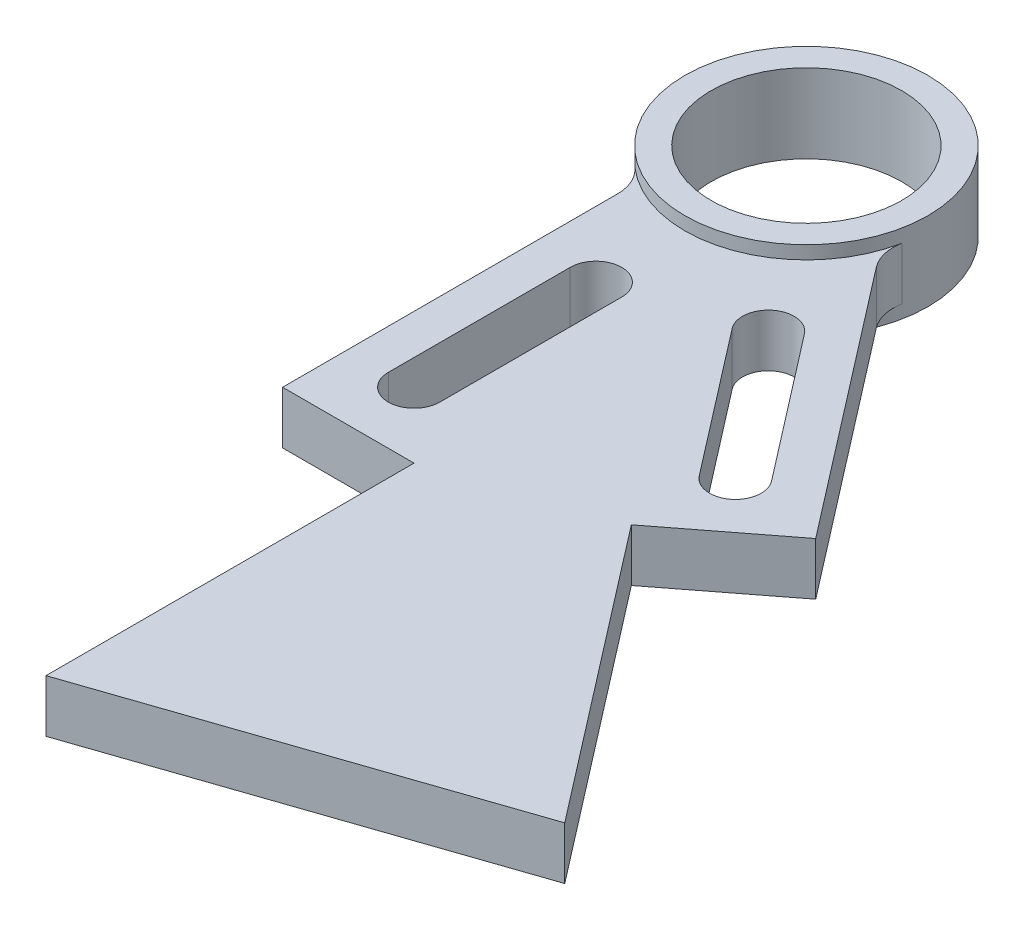
ISO-10303-21;
HEADER;
FILE_DESCRIPTION(('STEP AP214'),'2;1');
FILE_NAME('part.step','',(''),(''),'','','');
FILE_SCHEMA(('AUTOMOTIVE_DESIGN { 1 0 10303 214 1 1 1 1 }'));
ENDSEC;
DATA;
#1=APPLICATION_CONTEXT('core data for automotive mechanical design processes');
#2=APPLICATION_PROTOCOL_DEFINITION('international standard','automotive_design',2000,#1);
#3=PRODUCT_CONTEXT('',#1,'mechanical');
#4=PRODUCT('Part','Part','',(#3));
#5=PRODUCT_RELATED_PRODUCT_CATEGORY('part','',(#4));
#6=PRODUCT_DEFINITION_FORMATION('','',#4);
#7=PRODUCT_DEFINITION_CONTEXT('part definition',#1,'design');
#8=PRODUCT_DEFINITION('design','',#6,#7);
#9=PRODUCT_DEFINITION_SHAPE('','',#8);
#10=(LENGTH_UNIT() NAMED_UNIT(*) SI_UNIT(.MILLI.,.METRE.));
#11=(NAMED_UNIT(*) PLANE_ANGLE_UNIT() SI_UNIT($,.RADIAN.));
#12=(NAMED_UNIT(*) SI_UNIT($,.STERADIAN.) SOLID_ANGLE_UNIT());
#13=UNCERTAINTY_MEASURE_WITH_UNIT(LENGTH_MEASURE(1.E-05),#10,'distance_accuracy_value','');
#14=(GEOMETRIC_REPRESENTATION_CONTEXT(3) GLOBAL_UNCERTAINTY_ASSIGNED_CONTEXT((#13)) GLOBAL_UNIT_ASSIGNED_CONTEXT((#10,
#11,#12)) REPRESENTATION_CONTEXT('',''));
#15=CARTESIAN_POINT('',(0.,0.,0.));
#16=DIRECTION('',(0.,0.,1.));
#17=DIRECTION('',(1.,0.,0.));
#18=AXIS2_PLACEMENT_3D('',#15,#16,#17);
#19=CARTESIAN_POINT('',(0.,4.7625,0.));
#20=DIRECTION('',(0.,-1.,0.));
#21=DIRECTION('',(0.,0.,-1.));
#22=AXIS2_PLACEMENT_3D('',#19,#20,#21);
#23=CYLINDRICAL_SURFACE('',#22,11.5062);
#24=CARTESIAN_POINT('',(0.,4.7625,0.));
#25=DIRECTION('',(0.,1.,0.));
#26=DIRECTION('',(0.,0.,1.));
#27=AXIS2_PLACEMENT_3D('',#24,#25,#26);
#28=CIRCLE('',#27,11.5062);
#29=CARTESIAN_POINT('',(0.,4.7625,-11.5062));
#30=VERTEX_POINT('',#29);
#31=EDGE_CURVE('E353',#30,#30,#28,.T.);
#32=CARTESIAN_POINT('',(0.,-4.7625,0.));
#33=DIRECTION('',(0.,1.,0.));
#34=DIRECTION('',(0.,0.,1.));
#35=AXIS2_PLACEMENT_3D('',#32,#33,#34);
#36=CIRCLE('',#35,11.5062);
#37=CARTESIAN_POINT('',(0.,-4.7625,-11.5062));
#38=VERTEX_POINT('',#37);
#39=EDGE_CURVE('E326',#38,#38,#36,.T.);
#40=CARTESIAN_POINT('',(0.,4.7625,-11.5062));
#41=CARTESIAN_POINT('',(0.,4.66328125,-11.5062));
#42=CARTESIAN_POINT('',(0.,4.5640625,-11.5062));
#43=CARTESIAN_POINT('',(0.,4.365625,-11.5062));
#44=CARTESIAN_POINT('',(0.,4.26640625,-11.5062));
#45=CARTESIAN_POINT('',(0.,4.06796875,-11.5062));
#46=CARTESIAN_POINT('',(0.,3.96875,-11.5062));
#47=CARTESIAN_POINT('',(0.,3.7703125,-11.5062));
#48=CARTESIAN_POINT('',(0.,3.67109375,-11.5062));
#49=CARTESIAN_POINT('',(0.,3.47265625,-11.5062));
#50=CARTESIAN_POINT('',(0.,3.3734375,-11.5062));
#51=CARTESIAN_POINT('',(0.,3.175,-11.5062));
#52=CARTESIAN_POINT('',(0.,3.07578125,-11.5062));
#53=CARTESIAN_POINT('',(0.,2.87734375,-11.5062));
#54=CARTESIAN_POINT('',(0.,2.778125,-11.5062));
#55=CARTESIAN_POINT('',(0.,2.5796875,-11.5062));
#56=CARTESIAN_POINT('',(0.,2.48046875,-11.5062));
#57=CARTESIAN_POINT('',(0.,2.28203125,-11.5062));
#58=CARTESIAN_POINT('',(0.,2.1828125,-11.5062));
#59=CARTESIAN_POINT('',(0.,1.984375,-11.5062));
#60=CARTESIAN_POINT('',(0.,1.88515625,-11.5062));
#61=CARTESIAN_POINT('',(0.,1.68671875,-11.5062));
#62=CARTESIAN_POINT('',(0.,1.5875,-11.5062));
#63=CARTESIAN_POINT('',(0.,1.3890625,-11.5062));
#64=CARTESIAN_POINT('',(0.,1.28984375,-11.5062));
#65=CARTESIAN_POINT('',(0.,1.09140625,-11.5062));
#66=CARTESIAN_POINT('',(0.,0.992187499999999,-11.5062));
#67=CARTESIAN_POINT('',(0.,0.79375,-11.5062));
#68=CARTESIAN_POINT('',(0.,0.69453125,-11.5062));
#69=CARTESIAN_POINT('',(0.,0.49609375,-11.5062));
#70=CARTESIAN_POINT('',(0.,0.396875,-11.5062));
#71=CARTESIAN_POINT('',(0.,0.1984375,-11.5062));
#72=CARTESIAN_POINT('',(0.,0.0992187500000001,-11.5062));
#73=CARTESIAN_POINT('',(0.,-0.0992187500000001,-11.5062));
#74=CARTESIAN_POINT('',(0.,-0.1984375,-11.5062));
#75=CARTESIAN_POINT('',(0.,-0.396875,-11.5062));
#76=CARTESIAN_POINT('',(0.,-0.49609375,-11.5062));
#77=CARTESIAN_POINT('',(0.,-0.69453125,-11.5062));
#78=CARTESIAN_POINT('',(0.,-0.793750000000001,-11.5062));
#79=CARTESIAN_POINT('',(0.,-0.992187500000001,-11.5062));
#80=CARTESIAN_POINT('',(0.,-1.09140625,-11.5062));
#81=CARTESIAN_POINT('',(0.,-1.28984375,-11.5062));
#82=CARTESIAN_POINT('',(0.,-1.3890625,-11.5062));
#83=CARTESIAN_POINT('',(0.,-1.5875,-11.5062));
#84=CARTESIAN_POINT('',(0.,-1.68671875,-11.5062));
#85=CARTESIAN_POINT('',(0.,-1.88515625,-11.5062));
#86=CARTESIAN_POINT('',(0.,-1.984375,-11.5062));
#87=CARTESIAN_POINT('',(0.,-2.1828125,-11.5062));
#88=CARTESIAN_POINT('',(0.,-2.28203125,-11.5062));
#89=CARTESIAN_POINT('',(0.,-2.48046875,-11.5062));
#90=CARTESIAN_POINT('',(0.,-2.5796875,-11.5062));
#91=CARTESIAN_POINT('',(0.,-2.778125,-11.5062));
#92=CARTESIAN_POINT('',(0.,-2.87734375,-11.5062));
#93=CARTESIAN_POINT('',(0.,-3.07578125,-11.5062));
#94=CARTESIAN_POINT('',(0.,-3.175,-11.5062));
#95=CARTESIAN_POINT('',(0.,-3.3734375,-11.5062));
#96=CARTESIAN_POINT('',(0.,-3.47265625,-11.5062));
#97=CARTESIAN_POINT('',(0.,-3.67109375,-11.5062));
#98=CARTESIAN_POINT('',(0.,-3.7703125,-11.5062));
#99=CARTESIAN_POINT('',(0.,-3.96875,-11.5062));
#100=CARTESIAN_POINT('',(0.,-4.06796875,-11.5062));
#101=CARTESIAN_POINT('',(0.,-4.26640625,-11.5062));
#102=CARTESIAN_POINT('',(0.,-4.365625,-11.5062));
#103=CARTESIAN_POINT('',(0.,-4.5640625,-11.5062));
#104=CARTESIAN_POINT('',(0.,-4.66328125,-11.5062));
#105=CARTESIAN_POINT('',(0.,-4.7625,-11.5062));
#106=B_SPLINE_CURVE_WITH_KNOTS('',3,(#40,#41,#42,#43,#44,#45,#46,#47,#48,#49,#50,#51,#52,#53,
#54,#55,#56,#57,#58,#59,#60,#61,#62,#63,#64,#65,#66,#67,#68,#69,#70,#71,#72,#73,#74,#75,#76,#77,
#78,#79,#80,#81,#82,#83,#84,#85,#86,#87,#88,#89,#90,#91,#92,#93,#94,#95,#96,#97,#98,#99,#100,
#101,#102,#103,#104,#105),.UNSPECIFIED.,.F.,.F.,(4,2,2,2,2,2,2,2,2,2,2,2,2,2,2,2,2,2,2,2,2,2,2,
2,2,2,2,2,2,2,2,2,4),(0.,0.29765625,0.5953125,0.892968750000001,1.190625,1.48828125,1.7859375,
2.08359375,2.38125,2.67890625,2.9765625,3.27421875,3.571875,3.86953125,4.1671875,4.46484375,
4.7625,5.06015625,5.3578125,5.65546875,5.953125,6.25078125,6.5484375,6.84609375,7.14375,
7.44140625,7.7390625,8.03671875,8.334375,8.63203125,8.9296875,9.22734375,9.525),.UNSPECIFIED.);
#107=EDGE_CURVE('BSEAM48',#30,#38,#106,.T.);
#108=ORIENTED_EDGE('',*,*,#31,.T.);
#109=ORIENTED_EDGE('',*,*,#39,.F.);
#110=ORIENTED_EDGE('',*,*,#107,.T.);
#111=ORIENTED_EDGE('',*,*,#107,.F.);
#112=EDGE_LOOP('',(#108,#110,#109,#111));
#113=FACE_BOUND('',#112,.T.);
#114=ADVANCED_FACE('F48',(#113),#23,.F.);
#115=CARTESIAN_POINT('',(0.,4.7625,0.));
#116=DIRECTION('',(0.,-1.,0.));
#117=DIRECTION('',(0.,0.,-1.));
#118=AXIS2_PLACEMENT_3D('',#115,#116,#117);
#119=CYLINDRICAL_SURFACE('',#118,14.6812);
#120=DIRECTION('',(0.,-1.,0.));
#121=VECTOR('',#120,1.);
#122=CARTESIAN_POINT('',(14.4042451276911,4.7625,2.83819586029353));
#123=LINE('',#122,#121);
#124=CARTESIAN_POINT('',(14.4042451276911,3.175,2.83819586029353));
#125=VERTEX_POINT('',#124);
#126=CARTESIAN_POINT('',(14.4042451276911,-3.175,2.83819586029353));
#127=VERTEX_POINT('',#126);
#128=EDGE_CURVE('E372',#125,#127,#123,.T.);
#129=ORIENTED_EDGE('',*,*,#128,.T.);
#130=CARTESIAN_POINT('',(0.,-3.175,0.));
#131=DIRECTION('',(0.,1.,0.));
#132=DIRECTION('',(0.,0.,1.));
#133=AXIS2_PLACEMENT_3D('',#130,#131,#132);
#134=CIRCLE('',#133,14.6812);
#135=CARTESIAN_POINT('',(-9.67109897172235,-3.175,11.0456995305481));
#136=VERTEX_POINT('',#135);
#137=EDGE_CURVE('E279',#136,#127,#134,.T.);
#138=ORIENTED_EDGE('',*,*,#137,.F.);
#139=DIRECTION('',(0.,-1.,0.));
#140=VECTOR('',#139,1.);
#141=CARTESIAN_POINT('',(-9.67109897172235,4.7625,11.0456995305481));
#142=LINE('',#141,#140);
#143=CARTESIAN_POINT('',(-9.67109897172235,3.175,11.0456995305481));
#144=VERTEX_POINT('',#143);
#145=EDGE_CURVE('E362',#136,#144,#142,.F.);
#146=ORIENTED_EDGE('',*,*,#145,.T.);
#147=CARTESIAN_POINT('',(0.,3.175,0.));
#148=DIRECTION('',(0.,1.,0.));
#149=DIRECTION('',(0.,0.,1.));
#150=AXIS2_PLACEMENT_3D('',#147,#148,#149);
#151=CIRCLE('',#150,14.6812);
#152=EDGE_CURVE('E221',#144,#125,#151,.T.);
#153=ORIENTED_EDGE('',*,*,#152,.T.);
#154=EDGE_LOOP('',(#129,#138,#146,#153));
#155=FACE_BOUND('',#154,.T.);
#156=CARTESIAN_POINT('',(0.,4.7625,0.));
#157=DIRECTION('',(0.,1.,0.));
#158=DIRECTION('',(0.,0.,1.));
#159=AXIS2_PLACEMENT_3D('',#156,#157,#158);
#160=CIRCLE('',#159,14.6812);
#161=CARTESIAN_POINT('',(0.,4.7625,14.6812));
#162=VERTEX_POINT('',#161);
#163=EDGE_CURVE('E357',#162,#162,#160,.T.);
#164=ORIENTED_EDGE('',*,*,#163,.F.);
#165=EDGE_LOOP('',(#164));
#166=FACE_BOUND('',#165,.T.);
#167=CARTESIAN_POINT('',(0.,-4.7625,0.));
#168=DIRECTION('',(0.,1.,0.));
#169=DIRECTION('',(0.,0.,1.));
#170=AXIS2_PLACEMENT_3D('',#167,#168,#169);
#171=CIRCLE('',#170,14.6812);
#172=CARTESIAN_POINT('',(0.,-4.7625,14.6812));
#173=VERTEX_POINT('',#172);
#174=EDGE_CURVE('E358',#173,#173,#171,.T.);
#175=ORIENTED_EDGE('',*,*,#174,.T.);
#176=EDGE_LOOP('',(#175));
#177=FACE_BOUND('',#176,.T.);
#178=ADVANCED_FACE('F396',(#155,#166,#177),#119,.T.);
#179=CARTESIAN_POINT('',(0.,4.7625,0.));
#180=DIRECTION('',(0.,1.,0.));
#181=DIRECTION('',(0.,0.,1.));
#182=AXIS2_PLACEMENT_3D('',#179,#180,#181);
#183=PLANE('',#182);
#184=ORIENTED_EDGE('',*,*,#31,.F.);
#185=EDGE_LOOP('',(#184));
#186=FACE_BOUND('',#185,.T.);
#187=ORIENTED_EDGE('',*,*,#163,.T.);
#188=EDGE_LOOP('',(#187));
#189=FACE_BOUND('',#188,.T.);
#190=ADVANCED_FACE('F460',(#186,#189),#183,.T.);
#191=CARTESIAN_POINT('',(0.,-4.7625,0.));
#192=DIRECTION('',(0.,1.,0.));
#193=DIRECTION('',(0.,0.,1.));
#194=AXIS2_PLACEMENT_3D('',#191,#192,#193);
#195=PLANE('',#194);
#196=ORIENTED_EDGE('',*,*,#39,.T.);
#197=EDGE_LOOP('',(#196));
#198=FACE_BOUND('',#197,.T.);
#199=ORIENTED_EDGE('',*,*,#174,.F.);
#200=EDGE_LOOP('',(#199));
#201=FACE_BOUND('',#200,.T.);
#202=ADVANCED_FACE('F464',(#198,#201),#195,.F.);
#203=CARTESIAN_POINT('',(0.,3.175,25.4127));
#204=DIRECTION('',(0.,-1.,0.));
#205=DIRECTION('',(0.,0.,-1.));
#206=AXIS2_PLACEMENT_3D('',#203,#204,#205);
#207=CYLINDRICAL_SURFACE('',#206,3.1115);
#208=CARTESIAN_POINT('',(0.,-3.175,25.4127));
#209=DIRECTION('',(0.,1.,0.));
#210=DIRECTION('',(0.,0.,1.));
#211=AXIS2_PLACEMENT_3D('',#208,#209,#210);
#212=CIRCLE('',#211,3.1115);
#213=CARTESIAN_POINT('',(3.1115,-3.175,25.4127));
#214=VERTEX_POINT('',#213);
#215=CARTESIAN_POINT('',(-3.11150000000001,-3.175,25.4127));
#216=VERTEX_POINT('',#215);
#217=EDGE_CURVE('E298',#214,#216,#212,.T.);
#218=ORIENTED_EDGE('',*,*,#217,.F.);
#219=DIRECTION('',(0.,-1.,0.));
#220=VECTOR('',#219,1.);
#221=CARTESIAN_POINT('',(3.1115,3.175,25.4127));
#222=LINE('',#221,#220);
#223=CARTESIAN_POINT('',(3.1115,3.175,25.4127));
#224=VERTEX_POINT('',#223);
#225=EDGE_CURVE('E323',#224,#214,#222,.T.);
#226=ORIENTED_EDGE('',*,*,#225,.F.);
#227=CARTESIAN_POINT('',(0.,3.175,25.4127));
#228=DIRECTION('',(0.,1.,0.));
#229=DIRECTION('',(0.,0.,1.));
#230=AXIS2_PLACEMENT_3D('',#227,#228,#229);
#231=CIRCLE('',#230,3.1115);
#232=CARTESIAN_POINT('',(-3.11150000000001,3.175,25.4127));
#233=VERTEX_POINT('',#232);
#234=EDGE_CURVE('E238',#224,#233,#231,.T.);
#235=ORIENTED_EDGE('',*,*,#234,.T.);
#236=DIRECTION('',(0.,-1.,0.));
#237=VECTOR('',#236,1.);
#238=CARTESIAN_POINT('',(-3.11150000000001,3.175,25.4127));
#239=LINE('',#238,#237);
#240=EDGE_CURVE('E313',#233,#216,#239,.T.);
#241=ORIENTED_EDGE('',*,*,#240,.T.);
#242=EDGE_LOOP('',(#218,#226,#235,#241));
#243=FACE_BOUND('',#242,.T.);
#244=ADVANCED_FACE('F445',(#243),#207,.F.);
#245=CARTESIAN_POINT('',(3.11149999999999,3.175,0.));
#246=DIRECTION('',(-1.,0.,0.));
#247=DIRECTION('',(0.,0.,1.));
#248=AXIS2_PLACEMENT_3D('',#245,#246,#247);
#249=PLANE('',#248);
#250=DIRECTION('',(0.,0.,-1.));
#251=VECTOR('',#250,1.);
#252=CARTESIAN_POINT('',(3.11149999999999,-3.175,0.));
#253=LINE('',#252,#251);
#254=CARTESIAN_POINT('',(3.1115,-3.175,47.3837));
#255=VERTEX_POINT('',#254);
#256=EDGE_CURVE('E302',#255,#214,#253,.T.);
#257=ORIENTED_EDGE('',*,*,#256,.F.);
#258=DIRECTION('',(0.,-1.,0.));
#259=VECTOR('',#258,1.);
#260=CARTESIAN_POINT('',(3.1115,3.175,47.3837));
#261=LINE('',#260,#259);
#262=CARTESIAN_POINT('',(3.1115,3.175,47.3837));
#263=VERTEX_POINT('',#262);
#264=EDGE_CURVE('E320',#263,#255,#261,.T.);
#265=ORIENTED_EDGE('',*,*,#264,.F.);
#266=DIRECTION('',(0.,0.,-1.));
#267=VECTOR('',#266,1.);
#268=CARTESIAN_POINT('',(3.11149999999999,3.175,0.));
#269=LINE('',#268,#267);
#270=EDGE_CURVE('E242',#263,#224,#269,.T.);
#271=ORIENTED_EDGE('',*,*,#270,.T.);
#272=ORIENTED_EDGE('',*,*,#225,.T.);
#273=EDGE_LOOP('',(#257,#265,#271,#272));
#274=FACE_BOUND('',#273,.T.);
#275=ADVANCED_FACE('F438',(#274),#249,.T.);
#276=CARTESIAN_POINT('',(0.,3.175,47.3837));
#277=DIRECTION('',(0.,-1.,0.));
#278=DIRECTION('',(0.,0.,-1.));
#279=AXIS2_PLACEMENT_3D('',#276,#277,#278);
#280=CYLINDRICAL_SURFACE('',#279,3.1115);
#281=CARTESIAN_POINT('',(0.,-3.175,47.3837));
#282=DIRECTION('',(0.,1.,0.));
#283=DIRECTION('',(0.,0.,1.));
#284=AXIS2_PLACEMENT_3D('',#281,#282,#283);
#285=CIRCLE('',#284,3.1115);
#286=CARTESIAN_POINT('',(-3.1115,-3.175,47.3837));
#287=VERTEX_POINT('',#286);
#288=EDGE_CURVE('E306',#287,#255,#285,.T.);
#289=ORIENTED_EDGE('',*,*,#288,.F.);
#290=DIRECTION('',(0.,-1.,0.));
#291=VECTOR('',#290,1.);
#292=CARTESIAN_POINT('',(-3.1115,3.175,47.3837));
#293=LINE('',#292,#291);
#294=CARTESIAN_POINT('',(-3.1115,3.175,47.3837));
#295=VERTEX_POINT('',#294);
#296=EDGE_CURVE('E316',#295,#287,#293,.T.);
#297=ORIENTED_EDGE('',*,*,#296,.F.);
#298=CARTESIAN_POINT('',(0.,3.175,47.3837));
#299=DIRECTION('',(0.,1.,0.));
#300=DIRECTION('',(0.,0.,1.));
#301=AXIS2_PLACEMENT_3D('',#298,#299,#300);
#302=CIRCLE('',#301,3.1115);
#303=EDGE_CURVE('E246',#295,#263,#302,.T.);
#304=ORIENTED_EDGE('',*,*,#303,.T.);
#305=ORIENTED_EDGE('',*,*,#264,.T.);
#306=EDGE_LOOP('',(#289,#297,#304,#305));
#307=FACE_BOUND('',#306,.T.);
#308=ADVANCED_FACE('F442',(#307),#280,.F.);
#309=CARTESIAN_POINT('',(-6.28461938917185,3.175,4.84844979176339));
#310=DIRECTION('',(0.791763072651539,0.,-0.610828320222134));
#311=DIRECTION('',(-0.610828320222134,0.,-0.791763072651539));
#312=AXIS2_PLACEMENT_3D('',#309,#310,#311);
#313=PLANE('',#312);
#314=DIRECTION('',(0.610828320222134,0.,0.791763072651539));
#315=VECTOR('',#314,1.);
#316=CARTESIAN_POINT('',(-6.28461938917185,-3.175,4.84844979176339));
#317=LINE('',#316,#315);
#318=CARTESIAN_POINT('',(27.5071362795009,-3.175,48.6497330865337));
#319=VERTEX_POINT('',#318);
#320=CARTESIAN_POINT('',(54.6584551133747,-3.175,83.8436016658946));
#321=VERTEX_POINT('',#320);
#322=EDGE_CURVE('E267',#319,#321,#317,.T.);
#323=ORIENTED_EDGE('',*,*,#322,.F.);
#324=DIRECTION('',(0.,-1.,0.));
#325=VECTOR('',#324,1.);
#326=CARTESIAN_POINT('',(27.5071362795009,3.175,48.6497330865337));
#327=LINE('',#326,#325);
#328=CARTESIAN_POINT('',(27.5071362795009,3.175,48.6497330865337));
#329=VERTEX_POINT('',#328);
#330=EDGE_CURVE('E317',#329,#319,#327,.T.);
#331=ORIENTED_EDGE('',*,*,#330,.F.);
#332=DIRECTION('',(0.610828320222134,0.,0.791763072651539));
#333=VECTOR('',#332,1.);
#334=CARTESIAN_POINT('',(-6.28461938917185,3.175,4.84844979176339));
#335=LINE('',#334,#333);
#336=CARTESIAN_POINT('',(54.6584551133747,3.175,83.8436016658946));
#337=VERTEX_POINT('',#336);
#338=EDGE_CURVE('E209',#329,#337,#335,.T.);
#339=ORIENTED_EDGE('',*,*,#338,.T.);
#340=DIRECTION('',(0.,-1.,0.));
#341=VECTOR('',#340,1.);
#342=CARTESIAN_POINT('',(54.6584551133747,3.175,83.8436016658946));
#343=LINE('',#342,#341);
#344=EDGE_CURVE('E185',#337,#321,#343,.T.);
#345=ORIENTED_EDGE('',*,*,#344,.T.);
#346=EDGE_LOOP('',(#323,#331,#339,#345));
#347=FACE_BOUND('',#346,.T.);
#348=ADVANCED_FACE('F412',(#347),#313,.T.);
#349=CARTESIAN_POINT('',(33.7917556686727,3.175,43.8012832947703));
#350=DIRECTION('',(-0.610828320222133,0.,-0.791763072651539));
#351=DIRECTION('',(-0.791763072651539,0.,0.610828320222133));
#352=AXIS2_PLACEMENT_3D('',#349,#350,#351);
#353=PLANE('',#352);
#354=DIRECTION('',(0.791763072651539,0.,-0.610828320222133));
#355=VECTOR('',#354,1.);
#356=CARTESIAN_POINT('',(33.7917556686727,-3.175,43.8012832947703));
#357=LINE('',#356,#355);
#358=CARTESIAN_POINT('',(40.076375057844,-3.175,38.9528335030073));
#359=VERTEX_POINT('',#358);
#360=EDGE_CURVE('E271',#319,#359,#357,.T.);
#361=ORIENTED_EDGE('',*,*,#360,.T.);
#362=DIRECTION('',(0.,-1.,0.));
#363=VECTOR('',#362,1.);
#364=CARTESIAN_POINT('',(40.076375057844,3.175,38.9528335030073));
#365=LINE('',#364,#363);
#366=CARTESIAN_POINT('',(40.076375057844,3.175,38.9528335030073));
#367=VERTEX_POINT('',#366);
#368=EDGE_CURVE('E340',#367,#359,#365,.T.);
#369=ORIENTED_EDGE('',*,*,#368,.F.);
#370=DIRECTION('',(0.791763072651539,0.,-0.610828320222133));
#371=VECTOR('',#370,1.);
#372=CARTESIAN_POINT('',(33.7917556686727,3.175,43.8012832947703));
#373=LINE('',#372,#371);
#374=EDGE_CURVE('E213',#329,#367,#373,.T.);
#375=ORIENTED_EDGE('',*,*,#374,.F.);
#376=ORIENTED_EDGE('',*,*,#330,.T.);
#377=EDGE_LOOP('',(#361,#369,#375,#376));
#378=FACE_BOUND('',#377,.T.);
#379=ADVANCED_FACE('F409',(#378),#353,.F.);
#380=CARTESIAN_POINT('',(6.28461938917137,3.175,-4.84844979176301));
#381=DIRECTION('',(-0.79176307265154,0.,0.610828320222133));
#382=DIRECTION('',(0.610828320222133,0.,0.79176307265154));
#383=AXIS2_PLACEMENT_3D('',#380,#381,#382);
#384=PLANE('',#383);
#385=DIRECTION('',(-0.610828320222133,0.,-0.79176307265154));
#386=VECTOR('',#385,1.);
#387=CARTESIAN_POINT('',(6.28461938917137,-3.175,-4.84844979176301));
#388=LINE('',#387,#386);
#389=CARTESIAN_POINT('',(15.3662565828742,-3.175,6.92327841916506));
#390=VERTEX_POINT('',#389);
#391=EDGE_CURVE('E275',#359,#390,#388,.T.);
#392=ORIENTED_EDGE('',*,*,#391,.T.);
#393=DIRECTION('',(0.,1.,0.));
#394=VECTOR('',#393,1.);
#395=CARTESIAN_POINT('',(15.3662565828742,3.175,6.92327841916506));
#396=LINE('',#395,#394);
#397=CARTESIAN_POINT('',(15.3662565828742,3.175,6.92327841916506));
#398=VERTEX_POINT('',#397);
#399=EDGE_CURVE('E376',#390,#398,#396,.T.);
#400=ORIENTED_EDGE('',*,*,#399,.T.);
#401=DIRECTION('',(-0.610828320222133,0.,-0.79176307265154));
#402=VECTOR('',#401,1.);
#403=CARTESIAN_POINT('',(6.28461938917137,3.175,-4.84844979176301));
#404=LINE('',#403,#402);
#405=EDGE_CURVE('E217',#367,#398,#404,.T.);
#406=ORIENTED_EDGE('',*,*,#405,.F.);
#407=ORIENTED_EDGE('',*,*,#368,.T.);
#408=EDGE_LOOP('',(#392,#400,#406,#407));
#409=FACE_BOUND('',#408,.T.);
#410=ADVANCED_FACE('F405',(#409),#384,.F.);
#411=CARTESIAN_POINT('',(-7.93749999999998,3.175,0.));
#412=DIRECTION('',(-1.,0.,0.));
#413=DIRECTION('',(0.,0.,1.));
#414=AXIS2_PLACEMENT_3D('',#411,#412,#413);
#415=PLANE('',#414);
#416=DIRECTION('',(0.,0.,-1.));
#417=VECTOR('',#416,1.);
#418=CARTESIAN_POINT('',(-7.93749999999998,3.175,0.));
#419=LINE('',#418,#417);
#420=CARTESIAN_POINT('',(-7.93749999999998,3.175,55.3212));
#421=VERTEX_POINT('',#420);
#422=CARTESIAN_POINT('',(-7.93749999999998,3.175,14.8677408905994));
#423=VERTEX_POINT('',#422);
#424=EDGE_CURVE('E224',#421,#423,#419,.T.);
#425=ORIENTED_EDGE('',*,*,#424,.T.);
#426=DIRECTION('',(0.,-1.,0.));
#427=VECTOR('',#426,1.);
#428=CARTESIAN_POINT('',(-7.93749999999998,3.175,14.8677408905994));
#429=LINE('',#428,#427);
#430=CARTESIAN_POINT('',(-7.93749999999998,-3.175,14.8677408905994));
#431=VERTEX_POINT('',#430);
#432=EDGE_CURVE('E379',#423,#431,#429,.T.);
#433=ORIENTED_EDGE('',*,*,#432,.T.);
#434=DIRECTION('',(0.,0.,-1.));
#435=VECTOR('',#434,1.);
#436=CARTESIAN_POINT('',(-7.93749999999998,-3.175,0.));
#437=LINE('',#436,#435);
#438=CARTESIAN_POINT('',(-7.93749999999998,-3.175,55.3212));
#439=VERTEX_POINT('',#438);
#440=EDGE_CURVE('E282',#439,#431,#437,.T.);
#441=ORIENTED_EDGE('',*,*,#440,.F.);
#442=DIRECTION('',(0.,-1.,0.));
#443=VECTOR('',#442,1.);
#444=CARTESIAN_POINT('',(-7.93749999999998,3.175,55.3212));
#445=LINE('',#444,#443);
#446=EDGE_CURVE('E337',#421,#439,#445,.T.);
#447=ORIENTED_EDGE('',*,*,#446,.F.);
#448=EDGE_LOOP('',(#425,#433,#441,#447));
#449=FACE_BOUND('',#448,.T.);
#450=ADVANCED_FACE('F425',(#449),#415,.T.);
#451=CARTESIAN_POINT('',(0.,3.175,55.3212));
#452=DIRECTION('',(0.,0.,-1.));
#453=DIRECTION('',(-1.,0.,0.));
#454=AXIS2_PLACEMENT_3D('',#451,#452,#453);
#455=PLANE('',#454);
#456=DIRECTION('',(1.,0.,0.));
#457=VECTOR('',#456,1.);
#458=CARTESIAN_POINT('',(0.,-3.175,55.3212));
#459=LINE('',#458,#457);
#460=CARTESIAN_POINT('',(7.93750000000002,-3.175,55.3212));
#461=VERTEX_POINT('',#460);
#462=EDGE_CURVE('E286',#439,#461,#459,.T.);
#463=ORIENTED_EDGE('',*,*,#462,.T.);
#464=DIRECTION('',(0.,-1.,0.));
#465=VECTOR('',#464,1.);
#466=CARTESIAN_POINT('',(7.93750000000002,3.175,55.3212));
#467=LINE('',#466,#465);
#468=CARTESIAN_POINT('',(7.93750000000002,3.175,55.3212));
#469=VERTEX_POINT('',#468);
#470=EDGE_CURVE('E333',#469,#461,#467,.T.);
#471=ORIENTED_EDGE('',*,*,#470,.F.);
#472=DIRECTION('',(1.,0.,0.));
#473=VECTOR('',#472,1.);
#474=CARTESIAN_POINT('',(0.,3.175,55.3212));
#475=LINE('',#474,#473);
#476=EDGE_CURVE('E227',#421,#469,#475,.T.);
#477=ORIENTED_EDGE('',*,*,#476,.F.);
#478=ORIENTED_EDGE('',*,*,#446,.T.);
#479=EDGE_LOOP('',(#463,#471,#477,#478));
#480=FACE_BOUND('',#479,.T.);
#481=ADVANCED_FACE('F423',(#480),#455,.F.);
#482=CARTESIAN_POINT('',(7.93750000000005,3.175,0.));
#483=DIRECTION('',(1.,0.,0.));
#484=DIRECTION('',(0.,0.,-1.));
#485=AXIS2_PLACEMENT_3D('',#482,#483,#484);
#486=PLANE('',#485);
#487=DIRECTION('',(0.,0.,1.));
#488=VECTOR('',#487,1.);
#489=CARTESIAN_POINT('',(7.93750000000005,-3.175,0.));
#490=LINE('',#489,#488);
#491=CARTESIAN_POINT('',(7.9375,-3.175,99.7712));
#492=VERTEX_POINT('',#491);
#493=EDGE_CURVE('E290',#461,#492,#490,.T.);
#494=ORIENTED_EDGE('',*,*,#493,.T.);
#495=DIRECTION('',(0.,-1.,0.));
#496=VECTOR('',#495,1.);
#497=CARTESIAN_POINT('',(7.9375,3.175,99.7712));
#498=LINE('',#497,#496);
#499=CARTESIAN_POINT('',(7.9375,3.175,99.7712));
#500=VERTEX_POINT('',#499);
#501=EDGE_CURVE('E329',#500,#492,#498,.T.);
#502=ORIENTED_EDGE('',*,*,#501,.F.);
#503=DIRECTION('',(0.,0.,1.));
#504=VECTOR('',#503,1.);
#505=CARTESIAN_POINT('',(7.93750000000005,3.175,0.));
#506=LINE('',#505,#504);
#507=EDGE_CURVE('E231',#469,#500,#506,.T.);
#508=ORIENTED_EDGE('',*,*,#507,.F.);
#509=ORIENTED_EDGE('',*,*,#470,.T.);
#510=EDGE_LOOP('',(#494,#502,#508,#509));
#511=FACE_BOUND('',#510,.T.);
#512=ADVANCED_FACE('F420',(#511),#486,.F.);
#513=CARTESIAN_POINT('',(28.9433058769093,3.175,37.5166639055989));
#514=DIRECTION('',(0.,-1.,0.));
#515=DIRECTION('',(0.,0.,-1.));
#516=AXIS2_PLACEMENT_3D('',#513,#514,#515);
#517=CYLINDRICAL_SURFACE('',#516,3.1115);
#518=CARTESIAN_POINT('',(28.9433058769093,-3.175,37.5166639055989));
#519=DIRECTION('',(0.,1.,0.));
#520=DIRECTION('',(0.,0.,1.));
#521=AXIS2_PLACEMENT_3D('',#518,#519,#520);
#522=CIRCLE('',#521,3.1115);
#523=CARTESIAN_POINT('',(26.479735076354,-3.175,39.4172562239701));
#524=VERTEX_POINT('',#523);
#525=CARTESIAN_POINT('',(31.4068766774645,-3.175,35.6160715872278));
#526=VERTEX_POINT('',#525);
#527=EDGE_CURVE('E179',#524,#526,#522,.T.);
#528=ORIENTED_EDGE('',*,*,#527,.F.);
#529=DIRECTION('',(0.,-1.,0.));
#530=VECTOR('',#529,1.);
#531=CARTESIAN_POINT('',(26.479735076354,3.175,39.4172562239701));
#532=LINE('',#531,#530);
#533=CARTESIAN_POINT('',(26.479735076354,3.175,39.4172562239701));
#534=VERTEX_POINT('',#533);
#535=EDGE_CURVE('E174',#534,#524,#532,.T.);
#536=ORIENTED_EDGE('',*,*,#535,.F.);
#537=CARTESIAN_POINT('',(28.9433058769093,3.175,37.5166639055989));
#538=DIRECTION('',(0.,1.,0.));
#539=DIRECTION('',(0.,0.,1.));
#540=AXIS2_PLACEMENT_3D('',#537,#538,#539);
#541=CIRCLE('',#540,3.1115);
#542=CARTESIAN_POINT('',(31.4068766774645,3.175,35.6160715872278));
#543=VERTEX_POINT('',#542);
#544=EDGE_CURVE('E177',#534,#543,#541,.T.);
#545=ORIENTED_EDGE('',*,*,#544,.T.);
#546=DIRECTION('',(0.,-1.,0.));
#547=VECTOR('',#546,1.);
#548=CARTESIAN_POINT('',(31.4068766774645,3.175,35.6160715872278));
#549=LINE('',#548,#547);
#550=EDGE_CURVE('E253',#543,#526,#549,.T.);
#551=ORIENTED_EDGE('',*,*,#550,.T.);
#552=EDGE_LOOP('',(#528,#536,#545,#551));
#553=FACE_BOUND('',#552,.T.);
#554=ADVANCED_FACE('F176',(#553),#517,.F.);
#555=CARTESIAN_POINT('',(-2.46357080055549,3.175,1.90059231837134));
#556=DIRECTION('',(0.791763072651539,0.,-0.610828320222133));
#557=DIRECTION('',(-0.610828320222133,0.,-0.791763072651539));
#558=AXIS2_PLACEMENT_3D('',#555,#556,#557);
#559=PLANE('',#558);
#560=DIRECTION('',(0.610828320222133,0.,0.791763072651539));
#561=VECTOR('',#560,1.);
#562=CARTESIAN_POINT('',(-2.46357080055549,-3.175,1.90059231837134));
#563=LINE('',#562,#561);
#564=CARTESIAN_POINT('',(13.0592260527535,-3.175,22.0214297547431));
#565=VERTEX_POINT('',#564);
#566=EDGE_CURVE('E256',#565,#524,#563,.T.);
#567=ORIENTED_EDGE('',*,*,#566,.F.);
#568=DIRECTION('',(0.,-1.,0.));
#569=VECTOR('',#568,1.);
#570=CARTESIAN_POINT('',(13.0592260527535,3.175,22.0214297547431));
#571=LINE('',#570,#569);
#572=CARTESIAN_POINT('',(13.0592260527535,3.175,22.0214297547431));
#573=VERTEX_POINT('',#572);
#574=EDGE_CURVE('E186',#573,#565,#571,.T.);
#575=ORIENTED_EDGE('',*,*,#574,.F.);
#576=DIRECTION('',(0.610828320222133,0.,0.791763072651539));
#577=VECTOR('',#576,1.);
#578=CARTESIAN_POINT('',(-2.46357080055549,3.175,1.90059231837134));
#579=LINE('',#578,#577);
#580=EDGE_CURVE('E192',#573,#534,#579,.T.);
#581=ORIENTED_EDGE('',*,*,#580,.T.);
#582=ORIENTED_EDGE('',*,*,#535,.T.);
#583=EDGE_LOOP('',(#567,#575,#581,#582));
#584=FACE_BOUND('',#583,.T.);
#585=ADVANCED_FACE('F200',(#584),#559,.T.);
#586=CARTESIAN_POINT('',(15.5227968533088,3.175,20.120837436372));
#587=DIRECTION('',(0.,-1.,0.));
#588=DIRECTION('',(0.,0.,-1.));
#589=AXIS2_PLACEMENT_3D('',#586,#587,#588);
#590=CYLINDRICAL_SURFACE('',#589,3.11149999999999);
#591=CARTESIAN_POINT('',(15.5227968533088,-3.175,20.120837436372));
#592=DIRECTION('',(0.,1.,0.));
#593=DIRECTION('',(0.,0.,1.));
#594=AXIS2_PLACEMENT_3D('',#591,#592,#593);
#595=CIRCLE('',#594,3.11149999999999);
#596=CARTESIAN_POINT('',(17.986367653864,-3.175,18.2202451180008));
#597=VERTEX_POINT('',#596);
#598=EDGE_CURVE('E259',#597,#565,#595,.T.);
#599=ORIENTED_EDGE('',*,*,#598,.F.);
#600=DIRECTION('',(0.,-1.,0.));
#601=VECTOR('',#600,1.);
#602=CARTESIAN_POINT('',(17.986367653864,3.175,18.2202451180008));
#603=LINE('',#602,#601);
#604=CARTESIAN_POINT('',(17.986367653864,3.175,18.2202451180008));
#605=VERTEX_POINT('',#604);
#606=EDGE_CURVE('E348',#605,#597,#603,.T.);
#607=ORIENTED_EDGE('',*,*,#606,.F.);
#608=CARTESIAN_POINT('',(15.5227968533088,3.175,20.120837436372));
#609=DIRECTION('',(0.,1.,0.));
#610=DIRECTION('',(0.,0.,1.));
#611=AXIS2_PLACEMENT_3D('',#608,#609,#610);
#612=CIRCLE('',#611,3.11149999999999);
#613=EDGE_CURVE('E202',#605,#573,#612,.T.);
#614=ORIENTED_EDGE('',*,*,#613,.T.);
#615=ORIENTED_EDGE('',*,*,#574,.T.);
#616=EDGE_LOOP('',(#599,#607,#614,#615));
#617=FACE_BOUND('',#616,.T.);
#618=ADVANCED_FACE('F474',(#617),#590,.F.);
#619=CARTESIAN_POINT('',(31.2979775566873,3.175,91.8074008329473));
#620=DIRECTION('',(-0.322673927788146,0.,-0.946510188178537));
#621=DIRECTION('',(-0.946510188178538,0.,0.322673927788146));
#622=AXIS2_PLACEMENT_3D('',#619,#620,#621);
#623=PLANE('',#622);
#624=DIRECTION('',(0.946510188178538,0.,-0.322673927788146));
#625=VECTOR('',#624,1.);
#626=CARTESIAN_POINT('',(31.2979775566873,-3.175,91.8074008329473));
#627=LINE('',#626,#625);
#628=EDGE_CURVE('E294',#492,#321,#627,.T.);
#629=ORIENTED_EDGE('',*,*,#628,.T.);
#630=ORIENTED_EDGE('',*,*,#344,.F.);
#631=DIRECTION('',(0.946510188178538,0.,-0.322673927788146));
#632=VECTOR('',#631,1.);
#633=CARTESIAN_POINT('',(31.2979775566873,3.175,91.8074008329473));
#634=LINE('',#633,#632);
#635=EDGE_CURVE('E235',#500,#337,#634,.T.);
#636=ORIENTED_EDGE('',*,*,#635,.F.);
#637=ORIENTED_EDGE('',*,*,#501,.T.);
#638=EDGE_LOOP('',(#629,#630,#636,#637));
#639=FACE_BOUND('',#638,.T.);
#640=ADVANCED_FACE('F416',(#639),#623,.F.);
#641=CARTESIAN_POINT('',(2.46357080055501,3.175,-1.90059231837098));
#642=DIRECTION('',(0.791763072651539,0.,-0.610828320222134));
#643=DIRECTION('',(-0.610828320222134,0.,-0.791763072651539));
#644=AXIS2_PLACEMENT_3D('',#641,#642,#643);
#645=PLANE('',#644);
#646=DIRECTION('',(0.610828320222134,0.,0.791763072651539));
#647=VECTOR('',#646,1.);
#648=CARTESIAN_POINT('',(2.46357080055501,-3.175,-1.90059231837098));
#649=LINE('',#648,#647);
#650=EDGE_CURVE('E263',#597,#526,#649,.T.);
#651=ORIENTED_EDGE('',*,*,#650,.T.);
#652=ORIENTED_EDGE('',*,*,#550,.F.);
#653=DIRECTION('',(0.610828320222134,0.,0.791763072651539));
#654=VECTOR('',#653,1.);
#655=CARTESIAN_POINT('',(2.46357080055501,3.175,-1.90059231837098));
#656=LINE('',#655,#654);
#657=EDGE_CURVE('E195',#605,#543,#656,.T.);
#658=ORIENTED_EDGE('',*,*,#657,.F.);
#659=ORIENTED_EDGE('',*,*,#606,.T.);
#660=EDGE_LOOP('',(#651,#652,#658,#659));
#661=FACE_BOUND('',#660,.T.);
#662=ADVANCED_FACE('F478',(#661),#645,.F.);
#663=CARTESIAN_POINT('',(-3.11150000000001,3.175,0.));
#664=DIRECTION('',(-1.,0.,0.));
#665=DIRECTION('',(0.,0.,1.));
#666=AXIS2_PLACEMENT_3D('',#663,#664,#665);
#667=PLANE('',#666);
#668=DIRECTION('',(0.,0.,-1.));
#669=VECTOR('',#668,1.);
#670=CARTESIAN_POINT('',(-3.11150000000001,-3.175,0.));
#671=LINE('',#670,#669);
#672=EDGE_CURVE('E198',#287,#216,#671,.T.);
#673=ORIENTED_EDGE('',*,*,#672,.T.);
#674=ORIENTED_EDGE('',*,*,#240,.F.);
#675=DIRECTION('',(0.,0.,-1.));
#676=VECTOR('',#675,1.);
#677=CARTESIAN_POINT('',(-3.11150000000001,3.175,0.));
#678=LINE('',#677,#676);
#679=EDGE_CURVE('E250',#295,#233,#678,.T.);
#680=ORIENTED_EDGE('',*,*,#679,.F.);
#681=ORIENTED_EDGE('',*,*,#296,.T.);
#682=EDGE_LOOP('',(#673,#674,#680,#681));
#683=FACE_BOUND('',#682,.T.);
#684=ADVANCED_FACE('F428',(#683),#667,.F.);
#685=CARTESIAN_POINT('',(0.,3.175,0.));
#686=DIRECTION('',(0.,1.,0.));
#687=DIRECTION('',(0.,0.,1.));
#688=AXIS2_PLACEMENT_3D('',#685,#686,#687);
#689=PLANE('',#688);
#690=ORIENTED_EDGE('',*,*,#544,.F.);
#691=ORIENTED_EDGE('',*,*,#580,.F.);
#692=ORIENTED_EDGE('',*,*,#613,.F.);
#693=ORIENTED_EDGE('',*,*,#657,.T.);
#694=EDGE_LOOP('',(#690,#691,#692,#693));
#695=FACE_BOUND('',#694,.T.);
#696=ORIENTED_EDGE('',*,*,#338,.F.);
#697=ORIENTED_EDGE('',*,*,#374,.T.);
#698=ORIENTED_EDGE('',*,*,#405,.T.);
#699=CARTESIAN_POINT('',(19.3884129919441,3.175,3.82027055243662));
#700=DIRECTION('',(0.,1.,0.));
#701=DIRECTION('',(0.,0.,1.));
#702=AXIS2_PLACEMENT_3D('',#699,#700,#701);
#703=CIRCLE('',#702,5.08);
#704=EDGE_CURVE('E385',#398,#125,#703,.F.);
#705=ORIENTED_EDGE('',*,*,#704,.T.);
#706=ORIENTED_EDGE('',*,*,#152,.F.);
#707=CARTESIAN_POINT('',(-13.0175,3.175,14.8677408905994));
#708=DIRECTION('',(0.,1.,0.));
#709=DIRECTION('',(0.,0.,1.));
#710=AXIS2_PLACEMENT_3D('',#707,#708,#709);
#711=CIRCLE('',#710,5.08);
#712=EDGE_CURVE('E11',#144,#423,#711,.F.);
#713=ORIENTED_EDGE('',*,*,#712,.T.);
#714=ORIENTED_EDGE('',*,*,#424,.F.);
#715=ORIENTED_EDGE('',*,*,#476,.T.);
#716=ORIENTED_EDGE('',*,*,#507,.T.);
#717=ORIENTED_EDGE('',*,*,#635,.T.);
#718=EDGE_LOOP('',(#696,#697,#698,#705,#706,#713,#714,#715,#716,#717));
#719=FACE_BOUND('',#718,.T.);
#720=ORIENTED_EDGE('',*,*,#234,.F.);
#721=ORIENTED_EDGE('',*,*,#270,.F.);
#722=ORIENTED_EDGE('',*,*,#303,.F.);
#723=ORIENTED_EDGE('',*,*,#679,.T.);
#724=EDGE_LOOP('',(#720,#721,#722,#723));
#725=FACE_BOUND('',#724,.T.);
#726=ADVANCED_FACE('F190',(#695,#719,#725),#689,.T.);
#727=CARTESIAN_POINT('',(0.,-3.175,0.));
#728=DIRECTION('',(0.,1.,0.));
#729=DIRECTION('',(0.,0.,1.));
#730=AXIS2_PLACEMENT_3D('',#727,#728,#729);
#731=PLANE('',#730);
#732=ORIENTED_EDGE('',*,*,#527,.T.);
#733=ORIENTED_EDGE('',*,*,#650,.F.);
#734=ORIENTED_EDGE('',*,*,#598,.T.);
#735=ORIENTED_EDGE('',*,*,#566,.T.);
#736=EDGE_LOOP('',(#732,#733,#734,#735));
#737=FACE_BOUND('',#736,.T.);
#738=ORIENTED_EDGE('',*,*,#322,.T.);
#739=ORIENTED_EDGE('',*,*,#628,.F.);
#740=ORIENTED_EDGE('',*,*,#493,.F.);
#741=ORIENTED_EDGE('',*,*,#462,.F.);
#742=ORIENTED_EDGE('',*,*,#440,.T.);
#743=CARTESIAN_POINT('',(-13.0175,-3.175,14.8677408905994));
#744=DIRECTION('',(0.,1.,0.));
#745=DIRECTION('',(0.,0.,1.));
#746=AXIS2_PLACEMENT_3D('',#743,#744,#745);
#747=CIRCLE('',#746,5.08);
#748=EDGE_CURVE('E57',#431,#136,#747,.T.);
#749=ORIENTED_EDGE('',*,*,#748,.T.);
#750=ORIENTED_EDGE('',*,*,#137,.T.);
#751=CARTESIAN_POINT('',(19.3884129919441,-3.175,3.82027055243662));
#752=DIRECTION('',(0.,1.,0.));
#753=DIRECTION('',(0.,0.,1.));
#754=AXIS2_PLACEMENT_3D('',#751,#752,#753);
#755=CIRCLE('',#754,5.08);
#756=EDGE_CURVE('E382',#127,#390,#755,.T.);
#757=ORIENTED_EDGE('',*,*,#756,.T.);
#758=ORIENTED_EDGE('',*,*,#391,.F.);
#759=ORIENTED_EDGE('',*,*,#360,.F.);
#760=EDGE_LOOP('',(#738,#739,#740,#741,#742,#749,#750,#757,#758,#759));
#761=FACE_BOUND('',#760,.T.);
#762=ORIENTED_EDGE('',*,*,#217,.T.);
#763=ORIENTED_EDGE('',*,*,#672,.F.);
#764=ORIENTED_EDGE('',*,*,#288,.T.);
#765=ORIENTED_EDGE('',*,*,#256,.T.);
#766=EDGE_LOOP('',(#762,#763,#764,#765));
#767=FACE_BOUND('',#766,.T.);
#768=ADVANCED_FACE('F390',(#737,#761,#767),#731,.F.);
#769=CARTESIAN_POINT('',(19.3884129919441,4.7625,3.82027055243662));
#770=DIRECTION('',(0.,-1.,0.));
#771=DIRECTION('',(0.,0.,-1.));
#772=AXIS2_PLACEMENT_3D('',#769,#770,#771);
#773=CYLINDRICAL_SURFACE('',#772,5.08);
#774=ORIENTED_EDGE('',*,*,#704,.F.);
#775=ORIENTED_EDGE('',*,*,#399,.F.);
#776=ORIENTED_EDGE('',*,*,#756,.F.);
#777=ORIENTED_EDGE('',*,*,#128,.F.);
#778=EDGE_LOOP('',(#774,#775,#776,#777));
#779=FACE_BOUND('',#778,.T.);
#780=ADVANCED_FACE('F401',(#779),#773,.F.);
#781=CARTESIAN_POINT('',(-13.0175,4.7625,14.8677408905994));
#782=DIRECTION('',(0.,-1.,0.));
#783=DIRECTION('',(0.,0.,-1.));
#784=AXIS2_PLACEMENT_3D('',#781,#782,#783);
#785=CYLINDRICAL_SURFACE('',#784,5.08);
#786=ORIENTED_EDGE('',*,*,#712,.F.);
#787=ORIENTED_EDGE('',*,*,#145,.F.);
#788=ORIENTED_EDGE('',*,*,#748,.F.);
#789=ORIENTED_EDGE('',*,*,#432,.F.);
#790=EDGE_LOOP('',(#786,#787,#788,#789));
#791=FACE_BOUND('',#790,.T.);
#792=ADVANCED_FACE('F50',(#791),#785,.F.);
#793=CLOSED_SHELL('',(#114,#178,#190,#202,#244,#275,#308,#348,#379,#410,#450,#481,#512,#554,
#585,#618,#640,#662,#684,#726,#768,#780,#792));
#794=MANIFOLD_SOLID_BREP('B2',#793);
#795=ADVANCED_BREP_SHAPE_REPRESENTATION('',(#18,#794),#14);
#796=SHAPE_DEFINITION_REPRESENTATION(#9,#795);
ENDSEC;
END-ISO-10303-21;
